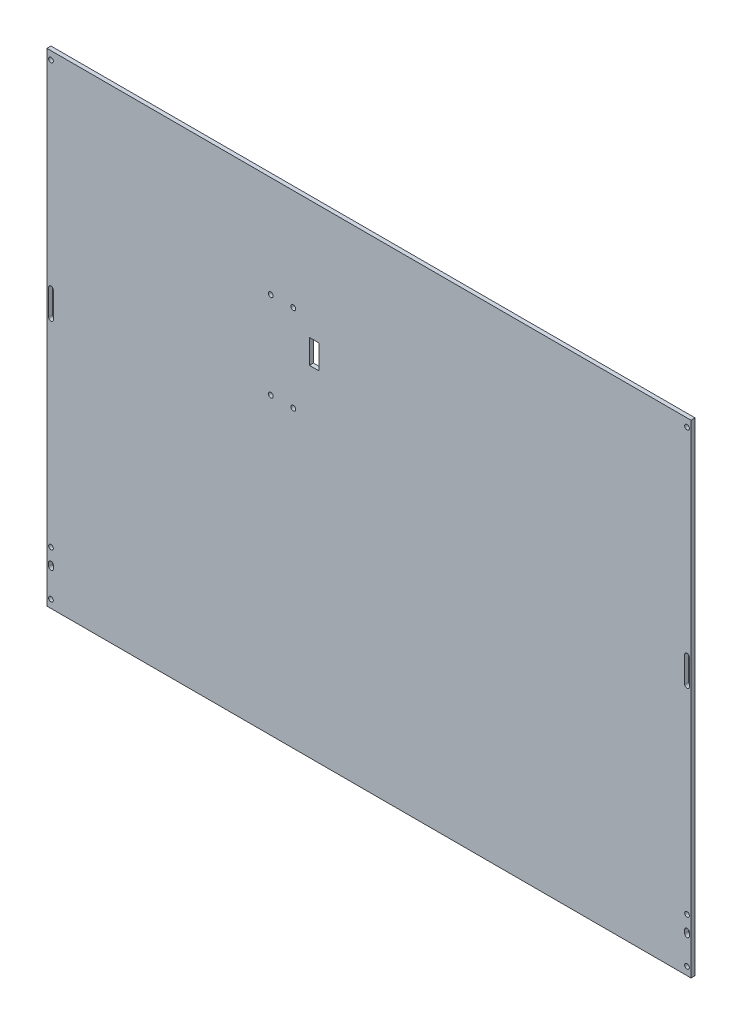
ISO-10303-21;
HEADER;
FILE_DESCRIPTION(('STEP AP214'),'2;1');
FILE_NAME('part.step','',(''),(''),'','','');
FILE_SCHEMA(('AUTOMOTIVE_DESIGN { 1 0 10303 214 1 1 1 1 }'));
ENDSEC;
DATA;
#1=APPLICATION_CONTEXT('core data for automotive mechanical design processes');
#2=APPLICATION_PROTOCOL_DEFINITION('international standard','automotive_design',2000,#1);
#3=PRODUCT_CONTEXT('',#1,'mechanical');
#4=PRODUCT('Part','Part','',(#3));
#5=PRODUCT_RELATED_PRODUCT_CATEGORY('part','',(#4));
#6=PRODUCT_DEFINITION_FORMATION('','',#4);
#7=PRODUCT_DEFINITION_CONTEXT('part definition',#1,'design');
#8=PRODUCT_DEFINITION('design','',#6,#7);
#9=PRODUCT_DEFINITION_SHAPE('','',#8);
#10=(LENGTH_UNIT() NAMED_UNIT(*) SI_UNIT(.MILLI.,.METRE.));
#11=(NAMED_UNIT(*) PLANE_ANGLE_UNIT() SI_UNIT($,.RADIAN.));
#12=(NAMED_UNIT(*) SI_UNIT($,.STERADIAN.) SOLID_ANGLE_UNIT());
#13=UNCERTAINTY_MEASURE_WITH_UNIT(LENGTH_MEASURE(1.E-05),#10,'distance_accuracy_value','');
#14=(GEOMETRIC_REPRESENTATION_CONTEXT(3) GLOBAL_UNCERTAINTY_ASSIGNED_CONTEXT((#13)) GLOBAL_UNIT_ASSIGNED_CONTEXT((#10,
#11,#12)) REPRESENTATION_CONTEXT('',''));
#15=CARTESIAN_POINT('',(0.,0.,0.));
#16=DIRECTION('',(0.,0.,1.));
#17=DIRECTION('',(1.,0.,0.));
#18=AXIS2_PLACEMENT_3D('',#15,#16,#17);
#19=CARTESIAN_POINT('',(254.,-190.5,3.175));
#20=DIRECTION('',(-1.,0.,0.));
#21=DIRECTION('',(0.,0.,1.));
#22=AXIS2_PLACEMENT_3D('',#19,#20,#21);
#23=PLANE('',#22);
#24=DIRECTION('',(0.,1.,0.));
#25=VECTOR('',#24,1.);
#26=CARTESIAN_POINT('',(254.,-190.5,0.));
#27=LINE('',#26,#25);
#28=CARTESIAN_POINT('',(254.,-190.5,0.));
#29=VERTEX_POINT('',#28);
#30=CARTESIAN_POINT('',(254.,190.5,0.));
#31=VERTEX_POINT('',#30);
#32=EDGE_CURVE('E501',#29,#31,#27,.T.);
#33=ORIENTED_EDGE('',*,*,#32,.T.);
#34=DIRECTION('',(0.,0.,-1.));
#35=VECTOR('',#34,1.);
#36=CARTESIAN_POINT('',(254.,190.5,3.175));
#37=LINE('',#36,#35);
#38=CARTESIAN_POINT('',(254.,190.5,3.175));
#39=VERTEX_POINT('',#38);
#40=EDGE_CURVE('E11',#39,#31,#37,.T.);
#41=ORIENTED_EDGE('',*,*,#40,.F.);
#42=DIRECTION('',(0.,1.,0.));
#43=VECTOR('',#42,1.);
#44=CARTESIAN_POINT('',(254.,-190.5,3.175));
#45=LINE('',#44,#43);
#46=CARTESIAN_POINT('',(254.,-190.5,3.175));
#47=VERTEX_POINT('',#46);
#48=EDGE_CURVE('E502',#47,#39,#45,.T.);
#49=ORIENTED_EDGE('',*,*,#48,.F.);
#50=DIRECTION('',(0.,0.,-1.));
#51=VECTOR('',#50,1.);
#52=CARTESIAN_POINT('',(254.,-190.5,3.175));
#53=LINE('',#52,#51);
#54=EDGE_CURVE('E516',#47,#29,#53,.T.);
#55=ORIENTED_EDGE('',*,*,#54,.T.);
#56=EDGE_LOOP('',(#33,#41,#49,#55));
#57=FACE_BOUND('',#56,.T.);
#58=ADVANCED_FACE('F43',(#57),#23,.F.);
#59=CARTESIAN_POINT('',(-254.,190.5,3.175));
#60=DIRECTION('',(0.,-1.,0.));
#61=DIRECTION('',(0.,0.,-1.));
#62=AXIS2_PLACEMENT_3D('',#59,#60,#61);
#63=PLANE('',#62);
#64=DIRECTION('',(-1.,0.,0.));
#65=VECTOR('',#64,1.);
#66=CARTESIAN_POINT('',(-254.,190.5,0.));
#67=LINE('',#66,#65);
#68=CARTESIAN_POINT('',(-254.,190.5,0.));
#69=VERTEX_POINT('',#68);
#70=EDGE_CURVE('E520',#31,#69,#67,.T.);
#71=ORIENTED_EDGE('',*,*,#70,.T.);
#72=DIRECTION('',(0.,0.,-1.));
#73=VECTOR('',#72,1.);
#74=CARTESIAN_POINT('',(-254.,190.5,3.175));
#75=LINE('',#74,#73);
#76=CARTESIAN_POINT('',(-254.,190.5,3.175));
#77=VERTEX_POINT('',#76);
#78=EDGE_CURVE('E51',#77,#69,#75,.T.);
#79=ORIENTED_EDGE('',*,*,#78,.F.);
#80=DIRECTION('',(-1.,0.,0.));
#81=VECTOR('',#80,1.);
#82=CARTESIAN_POINT('',(-254.,190.5,3.175));
#83=LINE('',#82,#81);
#84=EDGE_CURVE('E506',#39,#77,#83,.T.);
#85=ORIENTED_EDGE('',*,*,#84,.F.);
#86=ORIENTED_EDGE('',*,*,#40,.T.);
#87=EDGE_LOOP('',(#71,#79,#85,#86));
#88=FACE_BOUND('',#87,.T.);
#89=ADVANCED_FACE('F555',(#88),#63,.F.);
#90=CARTESIAN_POINT('',(-254.,-190.5,3.175));
#91=DIRECTION('',(1.,0.,0.));
#92=DIRECTION('',(0.,0.,-1.));
#93=AXIS2_PLACEMENT_3D('',#90,#91,#92);
#94=PLANE('',#93);
#95=DIRECTION('',(0.,-1.,0.));
#96=VECTOR('',#95,1.);
#97=CARTESIAN_POINT('',(-254.,-190.5,0.));
#98=LINE('',#97,#96);
#99=CARTESIAN_POINT('',(-254.,-190.5,0.));
#100=VERTEX_POINT('',#99);
#101=EDGE_CURVE('E523',#69,#100,#98,.T.);
#102=ORIENTED_EDGE('',*,*,#101,.T.);
#103=DIRECTION('',(0.,0.,-1.));
#104=VECTOR('',#103,1.);
#105=CARTESIAN_POINT('',(-254.,-190.5,3.175));
#106=LINE('',#105,#104);
#107=CARTESIAN_POINT('',(-254.,-190.5,3.175));
#108=VERTEX_POINT('',#107);
#109=EDGE_CURVE('E531',#108,#100,#106,.T.);
#110=ORIENTED_EDGE('',*,*,#109,.F.);
#111=DIRECTION('',(0.,-1.,0.));
#112=VECTOR('',#111,1.);
#113=CARTESIAN_POINT('',(-254.,-190.5,3.175));
#114=LINE('',#113,#112);
#115=EDGE_CURVE('E510',#77,#108,#114,.T.);
#116=ORIENTED_EDGE('',*,*,#115,.F.);
#117=ORIENTED_EDGE('',*,*,#78,.T.);
#118=EDGE_LOOP('',(#102,#110,#116,#117));
#119=FACE_BOUND('',#118,.T.);
#120=ADVANCED_FACE('F540',(#119),#94,.F.);
#121=CARTESIAN_POINT('',(-254.,-190.5,3.175));
#122=DIRECTION('',(0.,1.,0.));
#123=DIRECTION('',(0.,0.,1.));
#124=AXIS2_PLACEMENT_3D('',#121,#122,#123);
#125=PLANE('',#124);
#126=DIRECTION('',(1.,0.,0.));
#127=VECTOR('',#126,1.);
#128=CARTESIAN_POINT('',(-254.,-190.5,0.));
#129=LINE('',#128,#127);
#130=EDGE_CURVE('E507',#100,#29,#129,.T.);
#131=ORIENTED_EDGE('',*,*,#130,.T.);
#132=ORIENTED_EDGE('',*,*,#54,.F.);
#133=DIRECTION('',(1.,0.,0.));
#134=VECTOR('',#133,1.);
#135=CARTESIAN_POINT('',(-254.,-190.5,3.175));
#136=LINE('',#135,#134);
#137=EDGE_CURVE('E513',#108,#47,#136,.T.);
#138=ORIENTED_EDGE('',*,*,#137,.F.);
#139=ORIENTED_EDGE('',*,*,#109,.T.);
#140=EDGE_LOOP('',(#131,#132,#138,#139));
#141=FACE_BOUND('',#140,.T.);
#142=ADVANCED_FACE('F549',(#141),#125,.F.);
#143=CARTESIAN_POINT('',(0.,0.,3.175));
#144=DIRECTION('',(0.,0.,-1.));
#145=DIRECTION('',(-1.,0.,0.));
#146=AXIS2_PLACEMENT_3D('',#143,#144,#145);
#147=PLANE('',#146);
#148=CARTESIAN_POINT('',(250.825,-148.59,3.175));
#149=DIRECTION('',(0.,0.,1.));
#150=DIRECTION('',(-1.,0.,0.));
#151=AXIS2_PLACEMENT_3D('',#148,#149,#150);
#152=CIRCLE('',#151,1.85419999999999);
#153=CARTESIAN_POINT('',(248.9708,-148.59,3.175));
#154=VERTEX_POINT('',#153);
#155=EDGE_CURVE('E402',#154,#154,#152,.T.);
#156=ORIENTED_EDGE('',*,*,#155,.F.);
#157=EDGE_LOOP('',(#156));
#158=FACE_BOUND('',#157,.T.);
#159=CARTESIAN_POINT('',(-77.4886690000001,110.49,3.175));
#160=DIRECTION('',(0.,0.,1.));
#161=DIRECTION('',(1.,0.,0.));
#162=AXIS2_PLACEMENT_3D('',#159,#160,#161);
#163=CIRCLE('',#162,1.90499999999999);
#164=CARTESIAN_POINT('',(-75.5836690000001,110.49,3.175));
#165=VERTEX_POINT('',#164);
#166=EDGE_CURVE('E411',#165,#165,#163,.T.);
#167=ORIENTED_EDGE('',*,*,#166,.F.);
#168=EDGE_LOOP('',(#167));
#169=FACE_BOUND('',#168,.T.);
#170=CARTESIAN_POINT('',(-77.4886690000001,41.91,3.175));
#171=DIRECTION('',(0.,0.,1.));
#172=DIRECTION('',(1.,0.,0.));
#173=AXIS2_PLACEMENT_3D('',#170,#171,#172);
#174=CIRCLE('',#173,1.90499999999999);
#175=CARTESIAN_POINT('',(-75.5836690000001,41.91,3.175));
#176=VERTEX_POINT('',#175);
#177=EDGE_CURVE('E386',#176,#176,#174,.T.);
#178=ORIENTED_EDGE('',*,*,#177,.F.);
#179=EDGE_LOOP('',(#178));
#180=FACE_BOUND('',#179,.T.);
#181=CARTESIAN_POINT('',(-59.7086690000001,110.49,3.175));
#182=DIRECTION('',(0.,0.,1.));
#183=DIRECTION('',(1.,0.,0.));
#184=AXIS2_PLACEMENT_3D('',#181,#182,#183);
#185=CIRCLE('',#184,1.90499999999999);
#186=CARTESIAN_POINT('',(-57.8036690000001,110.49,3.175));
#187=VERTEX_POINT('',#186);
#188=EDGE_CURVE('E395',#187,#187,#185,.T.);
#189=ORIENTED_EDGE('',*,*,#188,.F.);
#190=EDGE_LOOP('',(#189));
#191=FACE_BOUND('',#190,.T.);
#192=CARTESIAN_POINT('',(-250.825,-148.59,3.175));
#193=DIRECTION('',(0.,0.,1.));
#194=DIRECTION('',(1.,0.,0.));
#195=AXIS2_PLACEMENT_3D('',#192,#193,#194);
#196=CIRCLE('',#195,1.85419999999999);
#197=CARTESIAN_POINT('',(-248.9708,-148.59,3.175));
#198=VERTEX_POINT('',#197);
#199=EDGE_CURVE('E443',#198,#198,#196,.T.);
#200=ORIENTED_EDGE('',*,*,#199,.F.);
#201=EDGE_LOOP('',(#200));
#202=FACE_BOUND('',#201,.T.);
#203=CARTESIAN_POINT('',(250.825,-184.15,3.175));
#204=DIRECTION('',(0.,0.,1.));
#205=DIRECTION('',(1.,0.,0.));
#206=AXIS2_PLACEMENT_3D('',#203,#204,#205);
#207=CIRCLE('',#206,1.85419999999999);
#208=CARTESIAN_POINT('',(252.6792,-184.15,3.175));
#209=VERTEX_POINT('',#208);
#210=EDGE_CURVE('E435',#209,#209,#207,.T.);
#211=ORIENTED_EDGE('',*,*,#210,.F.);
#212=EDGE_LOOP('',(#211));
#213=FACE_BOUND('',#212,.T.);
#214=CARTESIAN_POINT('',(250.825,184.15,3.175));
#215=DIRECTION('',(0.,0.,1.));
#216=DIRECTION('',(1.,0.,0.));
#217=AXIS2_PLACEMENT_3D('',#214,#215,#216);
#218=CIRCLE('',#217,1.85419999999999);
#219=CARTESIAN_POINT('',(252.6792,184.15,3.175));
#220=VERTEX_POINT('',#219);
#221=EDGE_CURVE('E427',#220,#220,#218,.T.);
#222=ORIENTED_EDGE('',*,*,#221,.F.);
#223=EDGE_LOOP('',(#222));
#224=FACE_BOUND('',#223,.T.);
#225=CARTESIAN_POINT('',(-250.825,184.15,3.175));
#226=DIRECTION('',(0.,0.,1.));
#227=DIRECTION('',(1.,0.,0.));
#228=AXIS2_PLACEMENT_3D('',#225,#226,#227);
#229=CIRCLE('',#228,1.85419999999999);
#230=CARTESIAN_POINT('',(-248.9708,184.15,3.175));
#231=VERTEX_POINT('',#230);
#232=EDGE_CURVE('E418',#231,#231,#229,.T.);
#233=ORIENTED_EDGE('',*,*,#232,.F.);
#234=EDGE_LOOP('',(#233));
#235=FACE_BOUND('',#234,.T.);
#236=DIRECTION('',(0.,1.,0.));
#237=VECTOR('',#236,1.);
#238=CARTESIAN_POINT('',(252.6792,-162.56,3.175));
#239=LINE('',#238,#237);
#240=CARTESIAN_POINT('',(252.6792,-162.56,3.175));
#241=VERTEX_POINT('',#240);
#242=CARTESIAN_POINT('',(252.6792,-160.02,3.175));
#243=VERTEX_POINT('',#242);
#244=EDGE_CURVE('E227',#241,#243,#239,.T.);
#245=ORIENTED_EDGE('',*,*,#244,.F.);
#246=CARTESIAN_POINT('',(250.825,-162.56,3.175));
#247=DIRECTION('',(0.,0.,1.));
#248=DIRECTION('',(-1.,0.,0.));
#249=AXIS2_PLACEMENT_3D('',#246,#247,#248);
#250=CIRCLE('',#249,1.85419999999997);
#251=CARTESIAN_POINT('',(248.9708,-162.56,3.175));
#252=VERTEX_POINT('',#251);
#253=EDGE_CURVE('E58',#252,#241,#250,.T.);
#254=ORIENTED_EDGE('',*,*,#253,.F.);
#255=DIRECTION('',(0.,-1.,0.));
#256=VECTOR('',#255,1.);
#257=CARTESIAN_POINT('',(248.9708,-162.56,3.175));
#258=LINE('',#257,#256);
#259=CARTESIAN_POINT('',(248.9708,-160.02,3.175));
#260=VERTEX_POINT('',#259);
#261=EDGE_CURVE('E215',#260,#252,#258,.T.);
#262=ORIENTED_EDGE('',*,*,#261,.F.);
#263=CARTESIAN_POINT('',(250.825,-160.02,3.175));
#264=DIRECTION('',(0.,0.,1.));
#265=DIRECTION('',(-1.,0.,0.));
#266=AXIS2_PLACEMENT_3D('',#263,#264,#265);
#267=CIRCLE('',#266,1.85419999999997);
#268=EDGE_CURVE('E221',#243,#260,#267,.T.);
#269=ORIENTED_EDGE('',*,*,#268,.F.);
#270=EDGE_LOOP('',(#245,#254,#262,#269));
#271=FACE_BOUND('',#270,.T.);
#272=CARTESIAN_POINT('',(-59.7086690000001,41.91,3.175));
#273=DIRECTION('',(0.,0.,1.));
#274=DIRECTION('',(1.,0.,0.));
#275=AXIS2_PLACEMENT_3D('',#272,#273,#274);
#276=CIRCLE('',#275,1.90499999999999);
#277=CARTESIAN_POINT('',(-57.8036690000001,41.91,3.175));
#278=VERTEX_POINT('',#277);
#279=EDGE_CURVE('E337',#278,#278,#276,.T.);
#280=ORIENTED_EDGE('',*,*,#279,.F.);
#281=EDGE_LOOP('',(#280));
#282=FACE_BOUND('',#281,.T.);
#283=CARTESIAN_POINT('',(-250.825,7.61999999999999,3.175));
#284=DIRECTION('',(0.,0.,1.));
#285=DIRECTION('',(1.,0.,0.));
#286=AXIS2_PLACEMENT_3D('',#283,#284,#285);
#287=CIRCLE('',#286,1.85420000000003);
#288=CARTESIAN_POINT('',(-252.6792,7.61999999999999,3.175));
#289=VERTEX_POINT('',#288);
#290=CARTESIAN_POINT('',(-248.9708,7.61999999999999,3.175));
#291=VERTEX_POINT('',#290);
#292=EDGE_CURVE('E346',#289,#291,#287,.T.);
#293=ORIENTED_EDGE('',*,*,#292,.F.);
#294=DIRECTION('',(0.,-1.,0.));
#295=VECTOR('',#294,1.);
#296=CARTESIAN_POINT('',(-252.6792,20.32,3.175));
#297=LINE('',#296,#295);
#298=CARTESIAN_POINT('',(-252.6792,27.94,3.175));
#299=VERTEX_POINT('',#298);
#300=EDGE_CURVE('E358',#299,#289,#297,.T.);
#301=ORIENTED_EDGE('',*,*,#300,.F.);
#302=CARTESIAN_POINT('',(-250.825,27.94,3.175));
#303=DIRECTION('',(0.,0.,1.));
#304=DIRECTION('',(1.,0.,0.));
#305=AXIS2_PLACEMENT_3D('',#302,#303,#304);
#306=CIRCLE('',#305,1.85419999999997);
#307=CARTESIAN_POINT('',(-248.9708,27.94,3.175));
#308=VERTEX_POINT('',#307);
#309=EDGE_CURVE('E361',#308,#299,#306,.T.);
#310=ORIENTED_EDGE('',*,*,#309,.F.);
#311=DIRECTION('',(0.,1.,0.));
#312=VECTOR('',#311,1.);
#313=CARTESIAN_POINT('',(-248.9708,20.32,3.175));
#314=LINE('',#313,#312);
#315=EDGE_CURVE('E366',#291,#308,#314,.T.);
#316=ORIENTED_EDGE('',*,*,#315,.F.);
#317=EDGE_LOOP('',(#293,#301,#310,#316));
#318=FACE_BOUND('',#317,.T.);
#319=DIRECTION('',(0.,-1.,0.));
#320=VECTOR('',#319,1.);
#321=CARTESIAN_POINT('',(248.9708,15.2399999999998,3.175));
#322=LINE('',#321,#320);
#323=CARTESIAN_POINT('',(248.9708,27.9399999999998,3.175));
#324=VERTEX_POINT('',#323);
#325=CARTESIAN_POINT('',(248.9708,7.61999999999984,3.175));
#326=VERTEX_POINT('',#325);
#327=EDGE_CURVE('E276',#324,#326,#322,.T.);
#328=ORIENTED_EDGE('',*,*,#327,.F.);
#329=CARTESIAN_POINT('',(250.825,27.9399999999998,3.175));
#330=DIRECTION('',(0.,0.,1.));
#331=DIRECTION('',(-1.,0.,0.));
#332=AXIS2_PLACEMENT_3D('',#329,#330,#331);
#333=CIRCLE('',#332,1.85419999999997);
#334=CARTESIAN_POINT('',(252.6792,27.9399999999998,3.175));
#335=VERTEX_POINT('',#334);
#336=EDGE_CURVE('E280',#335,#324,#333,.T.);
#337=ORIENTED_EDGE('',*,*,#336,.F.);
#338=DIRECTION('',(0.,1.,0.));
#339=VECTOR('',#338,1.);
#340=CARTESIAN_POINT('',(252.6792,20.3199999999998,3.175));
#341=LINE('',#340,#339);
#342=CARTESIAN_POINT('',(252.6792,7.61999999999984,3.175));
#343=VERTEX_POINT('',#342);
#344=EDGE_CURVE('E267',#343,#335,#341,.T.);
#345=ORIENTED_EDGE('',*,*,#344,.F.);
#346=CARTESIAN_POINT('',(250.825,7.61999999999984,3.175));
#347=DIRECTION('',(0.,0.,1.));
#348=DIRECTION('',(-1.,0.,0.));
#349=AXIS2_PLACEMENT_3D('',#346,#347,#348);
#350=CIRCLE('',#349,1.85420000000003);
#351=EDGE_CURVE('E271',#326,#343,#350,.T.);
#352=ORIENTED_EDGE('',*,*,#351,.F.);
#353=EDGE_LOOP('',(#328,#337,#345,#352));
#354=FACE_BOUND('',#353,.T.);
#355=DIRECTION('',(0.,1.,0.));
#356=VECTOR('',#355,1.);
#357=CARTESIAN_POINT('',(-248.9708,-162.56,3.175));
#358=LINE('',#357,#356);
#359=CARTESIAN_POINT('',(-248.9708,-162.56,3.175));
#360=VERTEX_POINT('',#359);
#361=CARTESIAN_POINT('',(-248.9708,-160.02,3.175));
#362=VERTEX_POINT('',#361);
#363=EDGE_CURVE('E317',#360,#362,#358,.T.);
#364=ORIENTED_EDGE('',*,*,#363,.F.);
#365=CARTESIAN_POINT('',(-250.825,-162.56,3.175));
#366=DIRECTION('',(0.,0.,1.));
#367=DIRECTION('',(1.,0.,0.));
#368=AXIS2_PLACEMENT_3D('',#365,#366,#367);
#369=CIRCLE('',#368,1.85419999999997);
#370=CARTESIAN_POINT('',(-252.6792,-162.56,3.175));
#371=VERTEX_POINT('',#370);
#372=EDGE_CURVE('E266',#371,#360,#369,.T.);
#373=ORIENTED_EDGE('',*,*,#372,.F.);
#374=DIRECTION('',(0.,-1.,0.));
#375=VECTOR('',#374,1.);
#376=CARTESIAN_POINT('',(-252.6792,-162.56,3.175));
#377=LINE('',#376,#375);
#378=CARTESIAN_POINT('',(-252.6792,-160.02,3.175));
#379=VERTEX_POINT('',#378);
#380=EDGE_CURVE('E308',#379,#371,#377,.T.);
#381=ORIENTED_EDGE('',*,*,#380,.F.);
#382=CARTESIAN_POINT('',(-250.825,-160.02,3.175));
#383=DIRECTION('',(0.,0.,1.));
#384=DIRECTION('',(1.,0.,0.));
#385=AXIS2_PLACEMENT_3D('',#382,#383,#384);
#386=CIRCLE('',#385,1.85419999999997);
#387=EDGE_CURVE('E312',#362,#379,#386,.T.);
#388=ORIENTED_EDGE('',*,*,#387,.F.);
#389=EDGE_LOOP('',(#364,#373,#381,#388));
#390=FACE_BOUND('',#389,.T.);
#391=CARTESIAN_POINT('',(-250.825,-184.15,3.175));
#392=DIRECTION('',(0.,0.,1.));
#393=DIRECTION('',(1.,0.,0.));
#394=AXIS2_PLACEMENT_3D('',#391,#392,#393);
#395=CIRCLE('',#394,1.85419999999999);
#396=CARTESIAN_POINT('',(-248.9708,-184.15,3.175));
#397=VERTEX_POINT('',#396);
#398=EDGE_CURVE('E422',#397,#397,#395,.T.);
#399=ORIENTED_EDGE('',*,*,#398,.F.);
#400=EDGE_LOOP('',(#399));
#401=FACE_BOUND('',#400,.T.);
#402=DIRECTION('',(0.,1.,0.));
#403=VECTOR('',#402,1.);
#404=CARTESIAN_POINT('',(-39.3700000000001,77.47,3.175));
#405=LINE('',#404,#403);
#406=CARTESIAN_POINT('',(-39.3700000000001,77.47,3.175));
#407=VERTEX_POINT('',#406);
#408=CARTESIAN_POINT('',(-39.3700000000001,96.52,3.175));
#409=VERTEX_POINT('',#408);
#410=EDGE_CURVE('E462',#407,#409,#405,.T.);
#411=ORIENTED_EDGE('',*,*,#410,.F.);
#412=DIRECTION('',(1.,0.,0.));
#413=VECTOR('',#412,1.);
#414=CARTESIAN_POINT('',(-46.9900000000001,77.47,3.175));
#415=LINE('',#414,#413);
#416=CARTESIAN_POINT('',(-46.9900000000001,77.47,3.175));
#417=VERTEX_POINT('',#416);
#418=EDGE_CURVE('E466',#417,#407,#415,.T.);
#419=ORIENTED_EDGE('',*,*,#418,.F.);
#420=DIRECTION('',(0.,-1.,0.));
#421=VECTOR('',#420,1.);
#422=CARTESIAN_POINT('',(-46.9900000000001,77.47,3.175));
#423=LINE('',#422,#421);
#424=CARTESIAN_POINT('',(-46.9900000000001,96.52,3.175));
#425=VERTEX_POINT('',#424);
#426=EDGE_CURVE('E454',#425,#417,#423,.T.);
#427=ORIENTED_EDGE('',*,*,#426,.F.);
#428=DIRECTION('',(-1.,0.,0.));
#429=VECTOR('',#428,1.);
#430=CARTESIAN_POINT('',(-46.9900000000001,96.52,3.175));
#431=LINE('',#430,#429);
#432=EDGE_CURVE('E458',#409,#425,#431,.T.);
#433=ORIENTED_EDGE('',*,*,#432,.F.);
#434=EDGE_LOOP('',(#411,#419,#427,#433));
#435=FACE_BOUND('',#434,.T.);
#436=ORIENTED_EDGE('',*,*,#48,.T.);
#437=ORIENTED_EDGE('',*,*,#84,.T.);
#438=ORIENTED_EDGE('',*,*,#115,.T.);
#439=ORIENTED_EDGE('',*,*,#137,.T.);
#440=EDGE_LOOP('',(#436,#437,#438,#439));
#441=FACE_BOUND('',#440,.T.);
#442=ADVANCED_FACE('F224',(#158,#169,#180,#191,#202,#213,#224,#235,#271,#282,#318,#354,#390,
#401,#435,#441),#147,.F.);
#443=CARTESIAN_POINT('',(0.,0.,0.));
#444=DIRECTION('',(0.,0.,-1.));
#445=DIRECTION('',(-1.,0.,0.));
#446=AXIS2_PLACEMENT_3D('',#443,#444,#445);
#447=PLANE('',#446);
#448=CARTESIAN_POINT('',(250.825,-148.59,0.));
#449=DIRECTION('',(0.,0.,1.));
#450=DIRECTION('',(-1.,0.,0.));
#451=AXIS2_PLACEMENT_3D('',#448,#449,#450);
#452=CIRCLE('',#451,1.85419999999999);
#453=CARTESIAN_POINT('',(248.9708,-148.59,0.));
#454=VERTEX_POINT('',#453);
#455=EDGE_CURVE('E407',#454,#454,#452,.T.);
#456=ORIENTED_EDGE('',*,*,#455,.T.);
#457=EDGE_LOOP('',(#456));
#458=FACE_BOUND('',#457,.T.);
#459=CARTESIAN_POINT('',(-77.4886690000001,110.49,0.));
#460=DIRECTION('',(0.,0.,1.));
#461=DIRECTION('',(1.,0.,0.));
#462=AXIS2_PLACEMENT_3D('',#459,#460,#461);
#463=CIRCLE('',#462,1.90499999999999);
#464=CARTESIAN_POINT('',(-75.5836690000001,110.49,0.));
#465=VERTEX_POINT('',#464);
#466=EDGE_CURVE('E390',#465,#465,#463,.T.);
#467=ORIENTED_EDGE('',*,*,#466,.T.);
#468=EDGE_LOOP('',(#467));
#469=FACE_BOUND('',#468,.T.);
#470=CARTESIAN_POINT('',(-77.4886690000001,41.91,0.));
#471=DIRECTION('',(0.,0.,1.));
#472=DIRECTION('',(1.,0.,0.));
#473=AXIS2_PLACEMENT_3D('',#470,#471,#472);
#474=CIRCLE('',#473,1.90499999999999);
#475=CARTESIAN_POINT('',(-75.5836690000001,41.91,0.));
#476=VERTEX_POINT('',#475);
#477=EDGE_CURVE('E391',#476,#476,#474,.T.);
#478=ORIENTED_EDGE('',*,*,#477,.T.);
#479=EDGE_LOOP('',(#478));
#480=FACE_BOUND('',#479,.T.);
#481=CARTESIAN_POINT('',(-59.7086690000001,110.49,0.));
#482=DIRECTION('',(0.,0.,1.));
#483=DIRECTION('',(1.,0.,0.));
#484=AXIS2_PLACEMENT_3D('',#481,#482,#483);
#485=CIRCLE('',#484,1.90499999999999);
#486=CARTESIAN_POINT('',(-57.8036690000001,110.49,0.));
#487=VERTEX_POINT('',#486);
#488=EDGE_CURVE('E341',#487,#487,#485,.T.);
#489=ORIENTED_EDGE('',*,*,#488,.T.);
#490=EDGE_LOOP('',(#489));
#491=FACE_BOUND('',#490,.T.);
#492=CARTESIAN_POINT('',(-250.825,-148.59,0.));
#493=DIRECTION('',(0.,0.,1.));
#494=DIRECTION('',(1.,0.,0.));
#495=AXIS2_PLACEMENT_3D('',#492,#493,#494);
#496=CIRCLE('',#495,1.85419999999999);
#497=CARTESIAN_POINT('',(-248.9708,-148.59,0.));
#498=VERTEX_POINT('',#497);
#499=EDGE_CURVE('E406',#498,#498,#496,.T.);
#500=ORIENTED_EDGE('',*,*,#499,.T.);
#501=EDGE_LOOP('',(#500));
#502=FACE_BOUND('',#501,.T.);
#503=CARTESIAN_POINT('',(250.825,-184.15,0.));
#504=DIRECTION('',(0.,0.,1.));
#505=DIRECTION('',(1.,0.,0.));
#506=AXIS2_PLACEMENT_3D('',#503,#504,#505);
#507=CIRCLE('',#506,1.85419999999999);
#508=CARTESIAN_POINT('',(252.6792,-184.15,0.));
#509=VERTEX_POINT('',#508);
#510=EDGE_CURVE('E439',#509,#509,#507,.T.);
#511=ORIENTED_EDGE('',*,*,#510,.T.);
#512=EDGE_LOOP('',(#511));
#513=FACE_BOUND('',#512,.T.);
#514=CARTESIAN_POINT('',(250.825,184.15,0.));
#515=DIRECTION('',(0.,0.,1.));
#516=DIRECTION('',(1.,0.,0.));
#517=AXIS2_PLACEMENT_3D('',#514,#515,#516);
#518=CIRCLE('',#517,1.85419999999999);
#519=CARTESIAN_POINT('',(252.6792,184.15,0.));
#520=VERTEX_POINT('',#519);
#521=EDGE_CURVE('E431',#520,#520,#518,.T.);
#522=ORIENTED_EDGE('',*,*,#521,.T.);
#523=EDGE_LOOP('',(#522));
#524=FACE_BOUND('',#523,.T.);
#525=CARTESIAN_POINT('',(-250.825,184.15,0.));
#526=DIRECTION('',(0.,0.,1.));
#527=DIRECTION('',(1.,0.,0.));
#528=AXIS2_PLACEMENT_3D('',#525,#526,#527);
#529=CIRCLE('',#528,1.85419999999999);
#530=CARTESIAN_POINT('',(-248.9708,184.15,0.));
#531=VERTEX_POINT('',#530);
#532=EDGE_CURVE('E423',#531,#531,#529,.T.);
#533=ORIENTED_EDGE('',*,*,#532,.T.);
#534=EDGE_LOOP('',(#533));
#535=FACE_BOUND('',#534,.T.);
#536=CARTESIAN_POINT('',(250.825,-162.56,0.));
#537=DIRECTION('',(0.,0.,1.));
#538=DIRECTION('',(-1.,0.,0.));
#539=AXIS2_PLACEMENT_3D('',#536,#537,#538);
#540=CIRCLE('',#539,1.85419999999997);
#541=CARTESIAN_POINT('',(248.9708,-162.56,0.));
#542=VERTEX_POINT('',#541);
#543=CARTESIAN_POINT('',(252.6792,-162.56,0.));
#544=VERTEX_POINT('',#543);
#545=EDGE_CURVE('E207',#542,#544,#540,.T.);
#546=ORIENTED_EDGE('',*,*,#545,.T.);
#547=DIRECTION('',(0.,1.,0.));
#548=VECTOR('',#547,1.);
#549=CARTESIAN_POINT('',(252.6792,-162.56,0.));
#550=LINE('',#549,#548);
#551=CARTESIAN_POINT('',(252.6792,-160.02,0.));
#552=VERTEX_POINT('',#551);
#553=EDGE_CURVE('E246',#544,#552,#550,.T.);
#554=ORIENTED_EDGE('',*,*,#553,.T.);
#555=CARTESIAN_POINT('',(250.825,-160.02,0.));
#556=DIRECTION('',(0.,0.,1.));
#557=DIRECTION('',(-1.,0.,0.));
#558=AXIS2_PLACEMENT_3D('',#555,#556,#557);
#559=CIRCLE('',#558,1.85419999999997);
#560=CARTESIAN_POINT('',(248.9708,-160.02,0.));
#561=VERTEX_POINT('',#560);
#562=EDGE_CURVE('E241',#552,#561,#559,.T.);
#563=ORIENTED_EDGE('',*,*,#562,.T.);
#564=DIRECTION('',(0.,-1.,0.));
#565=VECTOR('',#564,1.);
#566=CARTESIAN_POINT('',(248.9708,-162.56,0.));
#567=LINE('',#566,#565);
#568=EDGE_CURVE('E238',#561,#542,#567,.T.);
#569=ORIENTED_EDGE('',*,*,#568,.T.);
#570=EDGE_LOOP('',(#546,#554,#563,#569));
#571=FACE_BOUND('',#570,.T.);
#572=CARTESIAN_POINT('',(-59.7086690000001,41.91,0.));
#573=DIRECTION('',(0.,0.,1.));
#574=DIRECTION('',(1.,0.,0.));
#575=AXIS2_PLACEMENT_3D('',#572,#573,#574);
#576=CIRCLE('',#575,1.90499999999999);
#577=CARTESIAN_POINT('',(-57.8036690000001,41.91,0.));
#578=VERTEX_POINT('',#577);
#579=EDGE_CURVE('E342',#578,#578,#576,.T.);
#580=ORIENTED_EDGE('',*,*,#579,.T.);
#581=EDGE_LOOP('',(#580));
#582=FACE_BOUND('',#581,.T.);
#583=DIRECTION('',(0.,-1.,0.));
#584=VECTOR('',#583,1.);
#585=CARTESIAN_POINT('',(-252.6792,20.32,0.));
#586=LINE('',#585,#584);
#587=CARTESIAN_POINT('',(-252.6792,27.94,0.));
#588=VERTEX_POINT('',#587);
#589=CARTESIAN_POINT('',(-252.6792,7.61999999999999,0.));
#590=VERTEX_POINT('',#589);
#591=EDGE_CURVE('E362',#588,#590,#586,.T.);
#592=ORIENTED_EDGE('',*,*,#591,.T.);
#593=CARTESIAN_POINT('',(-250.825,7.61999999999999,0.));
#594=DIRECTION('',(0.,0.,1.));
#595=DIRECTION('',(1.,0.,0.));
#596=AXIS2_PLACEMENT_3D('',#593,#594,#595);
#597=CIRCLE('',#596,1.85420000000003);
#598=CARTESIAN_POINT('',(-248.9708,7.61999999999999,0.));
#599=VERTEX_POINT('',#598);
#600=EDGE_CURVE('E379',#590,#599,#597,.T.);
#601=ORIENTED_EDGE('',*,*,#600,.T.);
#602=DIRECTION('',(0.,1.,0.));
#603=VECTOR('',#602,1.);
#604=CARTESIAN_POINT('',(-248.9708,15.24,0.));
#605=LINE('',#604,#603);
#606=CARTESIAN_POINT('',(-248.9708,27.94,0.));
#607=VERTEX_POINT('',#606);
#608=EDGE_CURVE('E375',#599,#607,#605,.T.);
#609=ORIENTED_EDGE('',*,*,#608,.T.);
#610=CARTESIAN_POINT('',(-250.825,27.94,0.));
#611=DIRECTION('',(0.,0.,1.));
#612=DIRECTION('',(1.,0.,0.));
#613=AXIS2_PLACEMENT_3D('',#610,#611,#612);
#614=CIRCLE('',#613,1.85419999999997);
#615=EDGE_CURVE('E349',#607,#588,#614,.T.);
#616=ORIENTED_EDGE('',*,*,#615,.T.);
#617=EDGE_LOOP('',(#592,#601,#609,#616));
#618=FACE_BOUND('',#617,.T.);
#619=CARTESIAN_POINT('',(250.825,27.9399999999998,0.));
#620=DIRECTION('',(0.,0.,1.));
#621=DIRECTION('',(-1.,0.,0.));
#622=AXIS2_PLACEMENT_3D('',#619,#620,#621);
#623=CIRCLE('',#622,1.85419999999997);
#624=CARTESIAN_POINT('',(252.6792,27.9399999999998,0.));
#625=VERTEX_POINT('',#624);
#626=CARTESIAN_POINT('',(248.9708,27.9399999999998,0.));
#627=VERTEX_POINT('',#626);
#628=EDGE_CURVE('E272',#625,#627,#623,.T.);
#629=ORIENTED_EDGE('',*,*,#628,.T.);
#630=DIRECTION('',(0.,-1.,0.));
#631=VECTOR('',#630,1.);
#632=CARTESIAN_POINT('',(248.9708,20.3199999999998,0.));
#633=LINE('',#632,#631);
#634=CARTESIAN_POINT('',(248.9708,7.61999999999984,0.));
#635=VERTEX_POINT('',#634);
#636=EDGE_CURVE('E291',#627,#635,#633,.T.);
#637=ORIENTED_EDGE('',*,*,#636,.T.);
#638=CARTESIAN_POINT('',(250.825,7.61999999999984,0.));
#639=DIRECTION('',(0.,0.,1.));
#640=DIRECTION('',(-1.,0.,0.));
#641=AXIS2_PLACEMENT_3D('',#638,#639,#640);
#642=CIRCLE('',#641,1.85420000000003);
#643=CARTESIAN_POINT('',(252.6792,7.61999999999984,0.));
#644=VERTEX_POINT('',#643);
#645=EDGE_CURVE('E287',#635,#644,#642,.T.);
#646=ORIENTED_EDGE('',*,*,#645,.T.);
#647=DIRECTION('',(0.,1.,0.));
#648=VECTOR('',#647,1.);
#649=CARTESIAN_POINT('',(252.6792,15.2399999999998,0.));
#650=LINE('',#649,#648);
#651=EDGE_CURVE('E256',#644,#625,#650,.T.);
#652=ORIENTED_EDGE('',*,*,#651,.T.);
#653=EDGE_LOOP('',(#629,#637,#646,#652));
#654=FACE_BOUND('',#653,.T.);
#655=CARTESIAN_POINT('',(-250.825,-162.56,0.));
#656=DIRECTION('',(0.,0.,1.));
#657=DIRECTION('',(1.,0.,0.));
#658=AXIS2_PLACEMENT_3D('',#655,#656,#657);
#659=CIRCLE('',#658,1.85419999999997);
#660=CARTESIAN_POINT('',(-252.6792,-162.56,0.));
#661=VERTEX_POINT('',#660);
#662=CARTESIAN_POINT('',(-248.9708,-162.56,0.));
#663=VERTEX_POINT('',#662);
#664=EDGE_CURVE('E313',#661,#663,#659,.T.);
#665=ORIENTED_EDGE('',*,*,#664,.T.);
#666=DIRECTION('',(0.,1.,0.));
#667=VECTOR('',#666,1.);
#668=CARTESIAN_POINT('',(-248.9708,-162.56,0.));
#669=LINE('',#668,#667);
#670=CARTESIAN_POINT('',(-248.9708,-160.02,0.));
#671=VERTEX_POINT('',#670);
#672=EDGE_CURVE('E330',#663,#671,#669,.T.);
#673=ORIENTED_EDGE('',*,*,#672,.T.);
#674=CARTESIAN_POINT('',(-250.825,-160.02,0.));
#675=DIRECTION('',(0.,0.,1.));
#676=DIRECTION('',(1.,0.,0.));
#677=AXIS2_PLACEMENT_3D('',#674,#675,#676);
#678=CIRCLE('',#677,1.85419999999997);
#679=CARTESIAN_POINT('',(-252.6792,-160.02,0.));
#680=VERTEX_POINT('',#679);
#681=EDGE_CURVE('E326',#671,#680,#678,.T.);
#682=ORIENTED_EDGE('',*,*,#681,.T.);
#683=DIRECTION('',(0.,-1.,0.));
#684=VECTOR('',#683,1.);
#685=CARTESIAN_POINT('',(-252.6792,-162.56,0.));
#686=LINE('',#685,#684);
#687=EDGE_CURVE('E302',#680,#661,#686,.T.);
#688=ORIENTED_EDGE('',*,*,#687,.T.);
#689=EDGE_LOOP('',(#665,#673,#682,#688));
#690=FACE_BOUND('',#689,.T.);
#691=CARTESIAN_POINT('',(-250.825,-184.15,0.));
#692=DIRECTION('',(0.,0.,1.));
#693=DIRECTION('',(1.,0.,0.));
#694=AXIS2_PLACEMENT_3D('',#691,#692,#693);
#695=CIRCLE('',#694,1.85419999999999);
#696=CARTESIAN_POINT('',(-248.9708,-184.15,0.));
#697=VERTEX_POINT('',#696);
#698=EDGE_CURVE('E450',#697,#697,#695,.T.);
#699=ORIENTED_EDGE('',*,*,#698,.T.);
#700=EDGE_LOOP('',(#699));
#701=FACE_BOUND('',#700,.T.);
#702=DIRECTION('',(1.,0.,0.));
#703=VECTOR('',#702,1.);
#704=CARTESIAN_POINT('',(-46.9900000000001,77.47,0.));
#705=LINE('',#704,#703);
#706=CARTESIAN_POINT('',(-46.9900000000001,77.47,0.));
#707=VERTEX_POINT('',#706);
#708=CARTESIAN_POINT('',(-39.3700000000001,77.47,0.));
#709=VERTEX_POINT('',#708);
#710=EDGE_CURVE('E461',#707,#709,#705,.T.);
#711=ORIENTED_EDGE('',*,*,#710,.T.);
#712=DIRECTION('',(0.,1.,0.));
#713=VECTOR('',#712,1.);
#714=CARTESIAN_POINT('',(-39.3700000000001,77.47,0.));
#715=LINE('',#714,#713);
#716=CARTESIAN_POINT('',(-39.3700000000001,96.52,0.));
#717=VERTEX_POINT('',#716);
#718=EDGE_CURVE('E488',#709,#717,#715,.T.);
#719=ORIENTED_EDGE('',*,*,#718,.T.);
#720=DIRECTION('',(-1.,0.,0.));
#721=VECTOR('',#720,1.);
#722=CARTESIAN_POINT('',(-46.9900000000001,96.52,0.));
#723=LINE('',#722,#721);
#724=CARTESIAN_POINT('',(-46.9900000000001,96.52,0.));
#725=VERTEX_POINT('',#724);
#726=EDGE_CURVE('E483',#717,#725,#723,.T.);
#727=ORIENTED_EDGE('',*,*,#726,.T.);
#728=DIRECTION('',(0.,-1.,0.));
#729=VECTOR('',#728,1.);
#730=CARTESIAN_POINT('',(-46.9900000000001,77.47,0.));
#731=LINE('',#730,#729);
#732=EDGE_CURVE('E477',#725,#707,#731,.T.);
#733=ORIENTED_EDGE('',*,*,#732,.T.);
#734=EDGE_LOOP('',(#711,#719,#727,#733));
#735=FACE_BOUND('',#734,.T.);
#736=ORIENTED_EDGE('',*,*,#32,.F.);
#737=ORIENTED_EDGE('',*,*,#130,.F.);
#738=ORIENTED_EDGE('',*,*,#101,.F.);
#739=ORIENTED_EDGE('',*,*,#70,.F.);
#740=EDGE_LOOP('',(#736,#737,#738,#739));
#741=FACE_BOUND('',#740,.T.);
#742=ADVANCED_FACE('F546',(#458,#469,#480,#491,#502,#513,#524,#535,#571,#582,#618,#654,#690,
#701,#735,#741),#447,.T.);
#743=CARTESIAN_POINT('',(-46.9900000000001,77.47,-20.5174779151825));
#744=DIRECTION('',(0.,-1.,0.));
#745=DIRECTION('',(0.,0.,-1.));
#746=AXIS2_PLACEMENT_3D('',#743,#744,#745);
#747=PLANE('',#746);
#748=DIRECTION('',(0.,0.,1.));
#749=VECTOR('',#748,1.);
#750=CARTESIAN_POINT('',(-46.9900000000001,77.47,-20.5174779151825));
#751=LINE('',#750,#749);
#752=EDGE_CURVE('E481',#707,#417,#751,.T.);
#753=ORIENTED_EDGE('',*,*,#752,.T.);
#754=ORIENTED_EDGE('',*,*,#418,.T.);
#755=DIRECTION('',(0.,0.,1.));
#756=VECTOR('',#755,1.);
#757=CARTESIAN_POINT('',(-39.3700000000001,77.47,-20.5174779151825));
#758=LINE('',#757,#756);
#759=EDGE_CURVE('E476',#709,#407,#758,.T.);
#760=ORIENTED_EDGE('',*,*,#759,.F.);
#761=ORIENTED_EDGE('',*,*,#710,.F.);
#762=EDGE_LOOP('',(#753,#754,#760,#761));
#763=FACE_BOUND('',#762,.T.);
#764=ADVANCED_FACE('F567',(#763),#747,.F.);
#765=CARTESIAN_POINT('',(-39.3700000000001,77.47,-20.5174779151825));
#766=DIRECTION('',(1.,0.,0.));
#767=DIRECTION('',(0.,0.,-1.));
#768=AXIS2_PLACEMENT_3D('',#765,#766,#767);
#769=PLANE('',#768);
#770=ORIENTED_EDGE('',*,*,#759,.T.);
#771=ORIENTED_EDGE('',*,*,#410,.T.);
#772=DIRECTION('',(0.,0.,1.));
#773=VECTOR('',#772,1.);
#774=CARTESIAN_POINT('',(-39.3700000000001,96.52,-20.5174779151825));
#775=LINE('',#774,#773);
#776=EDGE_CURVE('E487',#717,#409,#775,.T.);
#777=ORIENTED_EDGE('',*,*,#776,.F.);
#778=ORIENTED_EDGE('',*,*,#718,.F.);
#779=EDGE_LOOP('',(#770,#771,#777,#778));
#780=FACE_BOUND('',#779,.T.);
#781=ADVANCED_FACE('F574',(#780),#769,.F.);
#782=CARTESIAN_POINT('',(-46.9900000000001,96.52,-20.5174779151825));
#783=DIRECTION('',(0.,1.,0.));
#784=DIRECTION('',(0.,0.,1.));
#785=AXIS2_PLACEMENT_3D('',#782,#783,#784);
#786=PLANE('',#785);
#787=ORIENTED_EDGE('',*,*,#776,.T.);
#788=ORIENTED_EDGE('',*,*,#432,.T.);
#789=DIRECTION('',(0.,0.,1.));
#790=VECTOR('',#789,1.);
#791=CARTESIAN_POINT('',(-46.9900000000001,96.52,-20.5174779151825));
#792=LINE('',#791,#790);
#793=EDGE_CURVE('E482',#725,#425,#792,.T.);
#794=ORIENTED_EDGE('',*,*,#793,.F.);
#795=ORIENTED_EDGE('',*,*,#726,.F.);
#796=EDGE_LOOP('',(#787,#788,#794,#795));
#797=FACE_BOUND('',#796,.T.);
#798=ADVANCED_FACE('F578',(#797),#786,.F.);
#799=CARTESIAN_POINT('',(-46.9900000000001,77.47,-20.5174779151825));
#800=DIRECTION('',(-1.,0.,0.));
#801=DIRECTION('',(0.,0.,1.));
#802=AXIS2_PLACEMENT_3D('',#799,#800,#801);
#803=PLANE('',#802);
#804=ORIENTED_EDGE('',*,*,#793,.T.);
#805=ORIENTED_EDGE('',*,*,#426,.T.);
#806=ORIENTED_EDGE('',*,*,#752,.F.);
#807=ORIENTED_EDGE('',*,*,#732,.F.);
#808=EDGE_LOOP('',(#804,#805,#806,#807));
#809=FACE_BOUND('',#808,.T.);
#810=ADVANCED_FACE('F582',(#809),#803,.F.);
#811=CARTESIAN_POINT('',(-250.825,-184.15,0.));
#812=DIRECTION('',(0.,0.,1.));
#813=DIRECTION('',(1.,0.,0.));
#814=AXIS2_PLACEMENT_3D('',#811,#812,#813);
#815=CYLINDRICAL_SURFACE('',#814,1.85419999999999);
#816=ORIENTED_EDGE('',*,*,#698,.F.);
#817=EDGE_LOOP('',(#816));
#818=FACE_BOUND('',#817,.T.);
#819=ORIENTED_EDGE('',*,*,#398,.T.);
#820=EDGE_LOOP('',(#819));
#821=FACE_BOUND('',#820,.T.);
#822=ADVANCED_FACE('F586',(#818,#821),#815,.F.);
#823=CARTESIAN_POINT('',(-250.825,-162.56,0.));
#824=DIRECTION('',(0.,0.,1.));
#825=DIRECTION('',(1.,0.,0.));
#826=AXIS2_PLACEMENT_3D('',#823,#824,#825);
#827=CYLINDRICAL_SURFACE('',#826,1.85419999999997);
#828=ORIENTED_EDGE('',*,*,#372,.T.);
#829=DIRECTION('',(0.,0.,1.));
#830=VECTOR('',#829,1.);
#831=CARTESIAN_POINT('',(-248.9708,-162.56,0.));
#832=LINE('',#831,#830);
#833=EDGE_CURVE('E298',#663,#360,#832,.T.);
#834=ORIENTED_EDGE('',*,*,#833,.F.);
#835=ORIENTED_EDGE('',*,*,#664,.F.);
#836=DIRECTION('',(0.,0.,1.));
#837=VECTOR('',#836,1.);
#838=CARTESIAN_POINT('',(-252.6792,-162.56,0.));
#839=LINE('',#838,#837);
#840=EDGE_CURVE('E229',#661,#371,#839,.T.);
#841=ORIENTED_EDGE('',*,*,#840,.T.);
#842=EDGE_LOOP('',(#828,#834,#835,#841));
#843=FACE_BOUND('',#842,.T.);
#844=ADVANCED_FACE('F590',(#843),#827,.F.);
#845=CARTESIAN_POINT('',(-252.6792,-162.56,0.));
#846=DIRECTION('',(-1.,0.,0.));
#847=DIRECTION('',(0.,0.,1.));
#848=AXIS2_PLACEMENT_3D('',#845,#846,#847);
#849=PLANE('',#848);
#850=ORIENTED_EDGE('',*,*,#380,.T.);
#851=ORIENTED_EDGE('',*,*,#840,.F.);
#852=ORIENTED_EDGE('',*,*,#687,.F.);
#853=DIRECTION('',(0.,0.,1.));
#854=VECTOR('',#853,1.);
#855=CARTESIAN_POINT('',(-252.6792,-160.02,0.));
#856=LINE('',#855,#854);
#857=EDGE_CURVE('E233',#680,#379,#856,.T.);
#858=ORIENTED_EDGE('',*,*,#857,.T.);
#859=EDGE_LOOP('',(#850,#851,#852,#858));
#860=FACE_BOUND('',#859,.T.);
#861=ADVANCED_FACE('F645',(#860),#849,.F.);
#862=CARTESIAN_POINT('',(-250.825,-160.02,0.));
#863=DIRECTION('',(0.,0.,1.));
#864=DIRECTION('',(1.,0.,0.));
#865=AXIS2_PLACEMENT_3D('',#862,#863,#864);
#866=CYLINDRICAL_SURFACE('',#865,1.85419999999997);
#867=ORIENTED_EDGE('',*,*,#387,.T.);
#868=ORIENTED_EDGE('',*,*,#857,.F.);
#869=ORIENTED_EDGE('',*,*,#681,.F.);
#870=DIRECTION('',(0.,0.,1.));
#871=VECTOR('',#870,1.);
#872=CARTESIAN_POINT('',(-248.9708,-160.02,0.));
#873=LINE('',#872,#871);
#874=EDGE_CURVE('E303',#671,#362,#873,.T.);
#875=ORIENTED_EDGE('',*,*,#874,.T.);
#876=EDGE_LOOP('',(#867,#868,#869,#875));
#877=FACE_BOUND('',#876,.T.);
#878=ADVANCED_FACE('F648',(#877),#866,.F.);
#879=CARTESIAN_POINT('',(-248.9708,-162.56,0.));
#880=DIRECTION('',(1.,0.,0.));
#881=DIRECTION('',(0.,0.,-1.));
#882=AXIS2_PLACEMENT_3D('',#879,#880,#881);
#883=PLANE('',#882);
#884=ORIENTED_EDGE('',*,*,#363,.T.);
#885=ORIENTED_EDGE('',*,*,#874,.F.);
#886=ORIENTED_EDGE('',*,*,#672,.F.);
#887=ORIENTED_EDGE('',*,*,#833,.T.);
#888=EDGE_LOOP('',(#884,#885,#886,#887));
#889=FACE_BOUND('',#888,.T.);
#890=ADVANCED_FACE('F652',(#889),#883,.F.);
#891=CARTESIAN_POINT('',(250.825,27.9399999999998,0.));
#892=DIRECTION('',(0.,0.,1.));
#893=DIRECTION('',(1.,0.,0.));
#894=AXIS2_PLACEMENT_3D('',#891,#892,#893);
#895=CYLINDRICAL_SURFACE('',#894,1.85419999999997);
#896=ORIENTED_EDGE('',*,*,#336,.T.);
#897=DIRECTION('',(0.,0.,1.));
#898=VECTOR('',#897,1.);
#899=CARTESIAN_POINT('',(248.9708,27.9399999999998,0.));
#900=LINE('',#899,#898);
#901=EDGE_CURVE('E252',#627,#324,#900,.T.);
#902=ORIENTED_EDGE('',*,*,#901,.F.);
#903=ORIENTED_EDGE('',*,*,#628,.F.);
#904=DIRECTION('',(0.,0.,1.));
#905=VECTOR('',#904,1.);
#906=CARTESIAN_POINT('',(252.6792,27.9399999999998,0.));
#907=LINE('',#906,#905);
#908=EDGE_CURVE('E263',#625,#335,#907,.T.);
#909=ORIENTED_EDGE('',*,*,#908,.T.);
#910=EDGE_LOOP('',(#896,#902,#903,#909));
#911=FACE_BOUND('',#910,.T.);
#912=ADVANCED_FACE('F656',(#911),#895,.F.);
#913=CARTESIAN_POINT('',(252.6792,20.3199999999998,0.));
#914=DIRECTION('',(1.,0.,0.));
#915=DIRECTION('',(0.,0.,-1.));
#916=AXIS2_PLACEMENT_3D('',#913,#914,#915);
#917=PLANE('',#916);
#918=ORIENTED_EDGE('',*,*,#344,.T.);
#919=ORIENTED_EDGE('',*,*,#908,.F.);
#920=ORIENTED_EDGE('',*,*,#651,.F.);
#921=DIRECTION('',(0.,0.,1.));
#922=VECTOR('',#921,1.);
#923=CARTESIAN_POINT('',(252.6792,7.61999999999984,0.));
#924=LINE('',#923,#922);
#925=EDGE_CURVE('E260',#644,#343,#924,.T.);
#926=ORIENTED_EDGE('',*,*,#925,.T.);
#927=EDGE_LOOP('',(#918,#919,#920,#926));
#928=FACE_BOUND('',#927,.T.);
#929=ADVANCED_FACE('F661',(#928),#917,.F.);
#930=CARTESIAN_POINT('',(250.825,7.61999999999984,0.));
#931=DIRECTION('',(0.,0.,1.));
#932=DIRECTION('',(1.,0.,0.));
#933=AXIS2_PLACEMENT_3D('',#930,#931,#932);
#934=CYLINDRICAL_SURFACE('',#933,1.85420000000003);
#935=ORIENTED_EDGE('',*,*,#351,.T.);
#936=ORIENTED_EDGE('',*,*,#925,.F.);
#937=ORIENTED_EDGE('',*,*,#645,.F.);
#938=DIRECTION('',(0.,0.,1.));
#939=VECTOR('',#938,1.);
#940=CARTESIAN_POINT('',(248.9708,7.61999999999984,0.));
#941=LINE('',#940,#939);
#942=EDGE_CURVE('E257',#635,#326,#941,.T.);
#943=ORIENTED_EDGE('',*,*,#942,.T.);
#944=EDGE_LOOP('',(#935,#936,#937,#943));
#945=FACE_BOUND('',#944,.T.);
#946=ADVANCED_FACE('F664',(#945),#934,.F.);
#947=CARTESIAN_POINT('',(248.9708,15.2399999999998,0.));
#948=DIRECTION('',(-1.,0.,0.));
#949=DIRECTION('',(0.,0.,1.));
#950=AXIS2_PLACEMENT_3D('',#947,#948,#949);
#951=PLANE('',#950);
#952=ORIENTED_EDGE('',*,*,#327,.T.);
#953=ORIENTED_EDGE('',*,*,#942,.F.);
#954=ORIENTED_EDGE('',*,*,#636,.F.);
#955=ORIENTED_EDGE('',*,*,#901,.T.);
#956=EDGE_LOOP('',(#952,#953,#954,#955));
#957=FACE_BOUND('',#956,.T.);
#958=ADVANCED_FACE('F629',(#957),#951,.F.);
#959=CARTESIAN_POINT('',(-252.6792,20.32,0.));
#960=DIRECTION('',(-1.,0.,0.));
#961=DIRECTION('',(0.,0.,1.));
#962=AXIS2_PLACEMENT_3D('',#959,#960,#961);
#963=PLANE('',#962);
#964=ORIENTED_EDGE('',*,*,#300,.T.);
#965=DIRECTION('',(0.,0.,1.));
#966=VECTOR('',#965,1.);
#967=CARTESIAN_POINT('',(-252.6792,7.61999999999999,0.));
#968=LINE('',#967,#966);
#969=EDGE_CURVE('E66',#590,#289,#968,.T.);
#970=ORIENTED_EDGE('',*,*,#969,.F.);
#971=ORIENTED_EDGE('',*,*,#591,.F.);
#972=DIRECTION('',(0.,0.,1.));
#973=VECTOR('',#972,1.);
#974=CARTESIAN_POINT('',(-252.6792,27.94,0.));
#975=LINE('',#974,#973);
#976=EDGE_CURVE('E283',#588,#299,#975,.T.);
#977=ORIENTED_EDGE('',*,*,#976,.T.);
#978=EDGE_LOOP('',(#964,#970,#971,#977));
#979=FACE_BOUND('',#978,.T.);
#980=ADVANCED_FACE('F625',(#979),#963,.F.);
#981=CARTESIAN_POINT('',(-250.825,27.94,0.));
#982=DIRECTION('',(0.,0.,1.));
#983=DIRECTION('',(1.,0.,0.));
#984=AXIS2_PLACEMENT_3D('',#981,#982,#983);
#985=CYLINDRICAL_SURFACE('',#984,1.85419999999997);
#986=ORIENTED_EDGE('',*,*,#309,.T.);
#987=ORIENTED_EDGE('',*,*,#976,.F.);
#988=ORIENTED_EDGE('',*,*,#615,.F.);
#989=DIRECTION('',(0.,0.,1.));
#990=VECTOR('',#989,1.);
#991=CARTESIAN_POINT('',(-248.9708,27.94,0.));
#992=LINE('',#991,#990);
#993=EDGE_CURVE('E353',#607,#308,#992,.T.);
#994=ORIENTED_EDGE('',*,*,#993,.T.);
#995=EDGE_LOOP('',(#986,#987,#988,#994));
#996=FACE_BOUND('',#995,.T.);
#997=ADVANCED_FACE('F628',(#996),#985,.F.);
#998=CARTESIAN_POINT('',(-248.9708,20.32,0.));
#999=DIRECTION('',(1.,0.,0.));
#1000=DIRECTION('',(0.,0.,-1.));
#1001=AXIS2_PLACEMENT_3D('',#998,#999,#1000);
#1002=PLANE('',#1001);
#1003=ORIENTED_EDGE('',*,*,#315,.T.);
#1004=ORIENTED_EDGE('',*,*,#993,.F.);
#1005=ORIENTED_EDGE('',*,*,#608,.F.);
#1006=DIRECTION('',(0.,0.,1.));
#1007=VECTOR('',#1006,1.);
#1008=CARTESIAN_POINT('',(-248.9708,7.61999999999999,0.));
#1009=LINE('',#1008,#1007);
#1010=EDGE_CURVE('E350',#599,#291,#1009,.T.);
#1011=ORIENTED_EDGE('',*,*,#1010,.T.);
#1012=EDGE_LOOP('',(#1003,#1004,#1005,#1011));
#1013=FACE_BOUND('',#1012,.T.);
#1014=ADVANCED_FACE('F633',(#1013),#1002,.F.);
#1015=CARTESIAN_POINT('',(-250.825,7.61999999999999,0.));
#1016=DIRECTION('',(0.,0.,1.));
#1017=DIRECTION('',(1.,0.,0.));
#1018=AXIS2_PLACEMENT_3D('',#1015,#1016,#1017);
#1019=CYLINDRICAL_SURFACE('',#1018,1.85420000000003);
#1020=ORIENTED_EDGE('',*,*,#292,.T.);
#1021=ORIENTED_EDGE('',*,*,#1010,.F.);
#1022=ORIENTED_EDGE('',*,*,#600,.F.);
#1023=ORIENTED_EDGE('',*,*,#969,.T.);
#1024=EDGE_LOOP('',(#1020,#1021,#1022,#1023));
#1025=FACE_BOUND('',#1024,.T.);
#1026=ADVANCED_FACE('F637',(#1025),#1019,.F.);
#1027=CARTESIAN_POINT('',(-59.7086690000001,41.91,0.));
#1028=DIRECTION('',(0.,0.,1.));
#1029=DIRECTION('',(1.,0.,0.));
#1030=AXIS2_PLACEMENT_3D('',#1027,#1028,#1029);
#1031=CYLINDRICAL_SURFACE('',#1030,1.90499999999999);
#1032=ORIENTED_EDGE('',*,*,#579,.F.);
#1033=EDGE_LOOP('',(#1032));
#1034=FACE_BOUND('',#1033,.T.);
#1035=ORIENTED_EDGE('',*,*,#279,.T.);
#1036=EDGE_LOOP('',(#1035));
#1037=FACE_BOUND('',#1036,.T.);
#1038=ADVANCED_FACE('F641',(#1034,#1037),#1031,.F.);
#1039=CARTESIAN_POINT('',(250.825,-162.56,0.));
#1040=DIRECTION('',(0.,0.,1.));
#1041=DIRECTION('',(1.,0.,0.));
#1042=AXIS2_PLACEMENT_3D('',#1039,#1040,#1041);
#1043=CYLINDRICAL_SURFACE('',#1042,1.85419999999997);
#1044=ORIENTED_EDGE('',*,*,#253,.T.);
#1045=DIRECTION('',(0.,0.,1.));
#1046=VECTOR('',#1045,1.);
#1047=CARTESIAN_POINT('',(252.6792,-162.56,0.));
#1048=LINE('',#1047,#1046);
#1049=EDGE_CURVE('E242',#544,#241,#1048,.T.);
#1050=ORIENTED_EDGE('',*,*,#1049,.F.);
#1051=ORIENTED_EDGE('',*,*,#545,.F.);
#1052=DIRECTION('',(0.,0.,1.));
#1053=VECTOR('',#1052,1.);
#1054=CARTESIAN_POINT('',(248.9708,-162.56,0.));
#1055=LINE('',#1054,#1053);
#1056=EDGE_CURVE('E203',#542,#252,#1055,.T.);
#1057=ORIENTED_EDGE('',*,*,#1056,.T.);
#1058=EDGE_LOOP('',(#1044,#1050,#1051,#1057));
#1059=FACE_BOUND('',#1058,.T.);
#1060=ADVANCED_FACE('F205',(#1059),#1043,.F.);
#1061=CARTESIAN_POINT('',(248.9708,-162.56,0.));
#1062=DIRECTION('',(-1.,0.,0.));
#1063=DIRECTION('',(0.,0.,1.));
#1064=AXIS2_PLACEMENT_3D('',#1061,#1062,#1063);
#1065=PLANE('',#1064);
#1066=ORIENTED_EDGE('',*,*,#261,.T.);
#1067=ORIENTED_EDGE('',*,*,#1056,.F.);
#1068=ORIENTED_EDGE('',*,*,#568,.F.);
#1069=DIRECTION('',(0.,0.,1.));
#1070=VECTOR('',#1069,1.);
#1071=CARTESIAN_POINT('',(248.9708,-160.02,0.));
#1072=LINE('',#1071,#1070);
#1073=EDGE_CURVE('E212',#561,#260,#1072,.T.);
#1074=ORIENTED_EDGE('',*,*,#1073,.T.);
#1075=EDGE_LOOP('',(#1066,#1067,#1068,#1074));
#1076=FACE_BOUND('',#1075,.T.);
#1077=ADVANCED_FACE('F216',(#1076),#1065,.F.);
#1078=CARTESIAN_POINT('',(250.825,-160.02,0.));
#1079=DIRECTION('',(0.,0.,1.));
#1080=DIRECTION('',(1.,0.,0.));
#1081=AXIS2_PLACEMENT_3D('',#1078,#1079,#1080);
#1082=CYLINDRICAL_SURFACE('',#1081,1.85419999999997);
#1083=ORIENTED_EDGE('',*,*,#268,.T.);
#1084=ORIENTED_EDGE('',*,*,#1073,.F.);
#1085=ORIENTED_EDGE('',*,*,#562,.F.);
#1086=DIRECTION('',(0.,0.,1.));
#1087=VECTOR('',#1086,1.);
#1088=CARTESIAN_POINT('',(252.6792,-160.02,0.));
#1089=LINE('',#1088,#1087);
#1090=EDGE_CURVE('E997',#552,#243,#1089,.T.);
#1091=ORIENTED_EDGE('',*,*,#1090,.T.);
#1092=EDGE_LOOP('',(#1083,#1084,#1085,#1091));
#1093=FACE_BOUND('',#1092,.T.);
#1094=ADVANCED_FACE('F677',(#1093),#1082,.F.);
#1095=CARTESIAN_POINT('',(252.6792,-162.56,0.));
#1096=DIRECTION('',(1.,0.,0.));
#1097=DIRECTION('',(0.,0.,-1.));
#1098=AXIS2_PLACEMENT_3D('',#1095,#1096,#1097);
#1099=PLANE('',#1098);
#1100=ORIENTED_EDGE('',*,*,#244,.T.);
#1101=ORIENTED_EDGE('',*,*,#1090,.F.);
#1102=ORIENTED_EDGE('',*,*,#553,.F.);
#1103=ORIENTED_EDGE('',*,*,#1049,.T.);
#1104=EDGE_LOOP('',(#1100,#1101,#1102,#1103));
#1105=FACE_BOUND('',#1104,.T.);
#1106=ADVANCED_FACE('F608',(#1105),#1099,.F.);
#1107=CARTESIAN_POINT('',(-250.825,184.15,0.));
#1108=DIRECTION('',(0.,0.,1.));
#1109=DIRECTION('',(1.,0.,0.));
#1110=AXIS2_PLACEMENT_3D('',#1107,#1108,#1109);
#1111=CYLINDRICAL_SURFACE('',#1110,1.85419999999999);
#1112=ORIENTED_EDGE('',*,*,#532,.F.);
#1113=EDGE_LOOP('',(#1112));
#1114=FACE_BOUND('',#1113,.T.);
#1115=ORIENTED_EDGE('',*,*,#232,.T.);
#1116=EDGE_LOOP('',(#1115));
#1117=FACE_BOUND('',#1116,.T.);
#1118=ADVANCED_FACE('F604',(#1114,#1117),#1111,.F.);
#1119=CARTESIAN_POINT('',(250.825,184.15,0.));
#1120=DIRECTION('',(0.,0.,1.));
#1121=DIRECTION('',(1.,0.,0.));
#1122=AXIS2_PLACEMENT_3D('',#1119,#1120,#1121);
#1123=CYLINDRICAL_SURFACE('',#1122,1.85419999999999);
#1124=ORIENTED_EDGE('',*,*,#521,.F.);
#1125=EDGE_LOOP('',(#1124));
#1126=FACE_BOUND('',#1125,.T.);
#1127=ORIENTED_EDGE('',*,*,#221,.T.);
#1128=EDGE_LOOP('',(#1127));
#1129=FACE_BOUND('',#1128,.T.);
#1130=ADVANCED_FACE('F600',(#1126,#1129),#1123,.F.);
#1131=CARTESIAN_POINT('',(250.825,-184.15,0.));
#1132=DIRECTION('',(0.,0.,1.));
#1133=DIRECTION('',(1.,0.,0.));
#1134=AXIS2_PLACEMENT_3D('',#1131,#1132,#1133);
#1135=CYLINDRICAL_SURFACE('',#1134,1.85419999999999);
#1136=ORIENTED_EDGE('',*,*,#510,.F.);
#1137=EDGE_LOOP('',(#1136));
#1138=FACE_BOUND('',#1137,.T.);
#1139=ORIENTED_EDGE('',*,*,#210,.T.);
#1140=EDGE_LOOP('',(#1139));
#1141=FACE_BOUND('',#1140,.T.);
#1142=ADVANCED_FACE('F596',(#1138,#1141),#1135,.F.);
#1143=CARTESIAN_POINT('',(-250.825,-148.59,0.));
#1144=DIRECTION('',(0.,0.,1.));
#1145=DIRECTION('',(1.,0.,0.));
#1146=AXIS2_PLACEMENT_3D('',#1143,#1144,#1145);
#1147=CYLINDRICAL_SURFACE('',#1146,1.85419999999999);
#1148=ORIENTED_EDGE('',*,*,#499,.F.);
#1149=EDGE_LOOP('',(#1148));
#1150=FACE_BOUND('',#1149,.T.);
#1151=ORIENTED_EDGE('',*,*,#199,.T.);
#1152=EDGE_LOOP('',(#1151));
#1153=FACE_BOUND('',#1152,.T.);
#1154=ADVANCED_FACE('F592',(#1150,#1153),#1147,.F.);
#1155=CARTESIAN_POINT('',(-59.7086690000001,110.49,0.));
#1156=DIRECTION('',(0.,0.,1.));
#1157=DIRECTION('',(1.,0.,0.));
#1158=AXIS2_PLACEMENT_3D('',#1155,#1156,#1157);
#1159=CYLINDRICAL_SURFACE('',#1158,1.90499999999999);
#1160=ORIENTED_EDGE('',*,*,#488,.F.);
#1161=EDGE_LOOP('',(#1160));
#1162=FACE_BOUND('',#1161,.T.);
#1163=ORIENTED_EDGE('',*,*,#188,.T.);
#1164=EDGE_LOOP('',(#1163));
#1165=FACE_BOUND('',#1164,.T.);
#1166=ADVANCED_FACE('F595',(#1162,#1165),#1159,.F.);
#1167=CARTESIAN_POINT('',(-77.4886690000001,41.91,0.));
#1168=DIRECTION('',(0.,0.,1.));
#1169=DIRECTION('',(1.,0.,0.));
#1170=AXIS2_PLACEMENT_3D('',#1167,#1168,#1169);
#1171=CYLINDRICAL_SURFACE('',#1170,1.90499999999999);
#1172=ORIENTED_EDGE('',*,*,#477,.F.);
#1173=EDGE_LOOP('',(#1172));
#1174=FACE_BOUND('',#1173,.T.);
#1175=ORIENTED_EDGE('',*,*,#177,.T.);
#1176=EDGE_LOOP('',(#1175));
#1177=FACE_BOUND('',#1176,.T.);
#1178=ADVANCED_FACE('F614',(#1174,#1177),#1171,.F.);
#1179=CARTESIAN_POINT('',(-77.4886690000001,110.49,0.));
#1180=DIRECTION('',(0.,0.,1.));
#1181=DIRECTION('',(1.,0.,0.));
#1182=AXIS2_PLACEMENT_3D('',#1179,#1180,#1181);
#1183=CYLINDRICAL_SURFACE('',#1182,1.90499999999999);
#1184=ORIENTED_EDGE('',*,*,#466,.F.);
#1185=EDGE_LOOP('',(#1184));
#1186=FACE_BOUND('',#1185,.T.);
#1187=ORIENTED_EDGE('',*,*,#166,.T.);
#1188=EDGE_LOOP('',(#1187));
#1189=FACE_BOUND('',#1188,.T.);
#1190=ADVANCED_FACE('F610',(#1186,#1189),#1183,.F.);
#1191=CARTESIAN_POINT('',(250.825,-148.59,0.));
#1192=DIRECTION('',(0.,0.,1.));
#1193=DIRECTION('',(1.,0.,0.));
#1194=AXIS2_PLACEMENT_3D('',#1191,#1192,#1193);
#1195=CYLINDRICAL_SURFACE('',#1194,1.85419999999999);
#1196=ORIENTED_EDGE('',*,*,#455,.F.);
#1197=EDGE_LOOP('',(#1196));
#1198=FACE_BOUND('',#1197,.T.);
#1199=ORIENTED_EDGE('',*,*,#155,.T.);
#1200=EDGE_LOOP('',(#1199));
#1201=FACE_BOUND('',#1200,.T.);
#1202=ADVANCED_FACE('F613',(#1198,#1201),#1195,.F.);
#1203=CLOSED_SHELL('',(#58,#89,#120,#142,#442,#742,#764,#781,#798,#810,#822,#844,#861,#878,#890,
#912,#929,#946,#958,#980,#997,#1014,#1026,#1038,#1060,#1077,#1094,#1106,#1118,#1130,#1142,#1154,
#1166,#1178,#1190,#1202));
#1204=MANIFOLD_SOLID_BREP('B2',#1203);
#1205=ADVANCED_BREP_SHAPE_REPRESENTATION('',(#18,#1204),#14);
#1206=SHAPE_DEFINITION_REPRESENTATION(#9,#1205);
ENDSEC;
END-ISO-10303-21;
